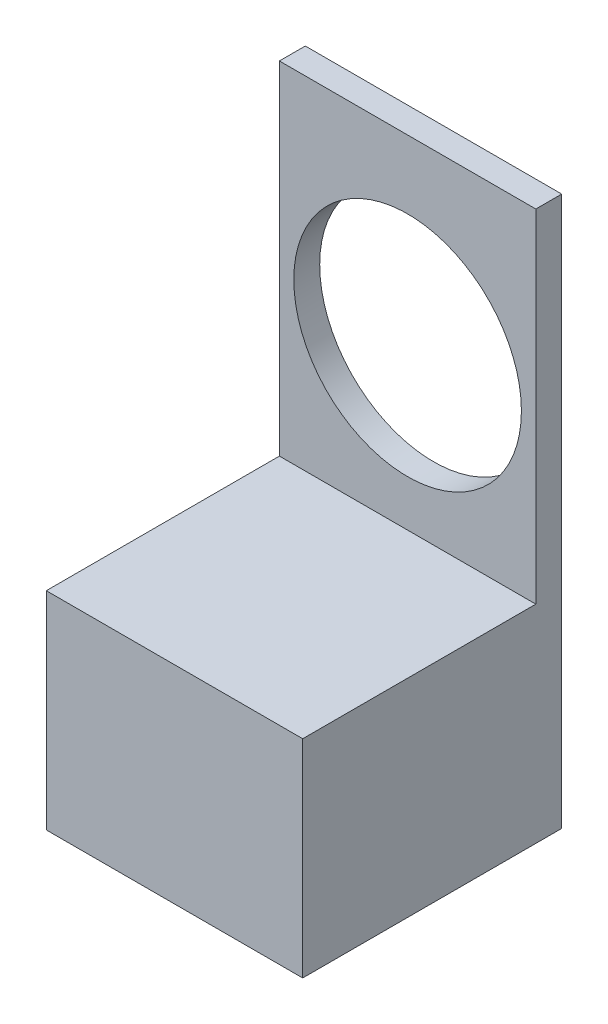
ISO-10303-21;
HEADER;
FILE_DESCRIPTION(('STEP AP214'),'2;1');
FILE_NAME('part.step','',(''),(''),'','','');
FILE_SCHEMA(('AUTOMOTIVE_DESIGN { 1 0 10303 214 1 1 1 1 }'));
ENDSEC;
DATA;
#1=APPLICATION_CONTEXT('core data for automotive mechanical design processes');
#2=APPLICATION_PROTOCOL_DEFINITION('international standard','automotive_design',2000,#1);
#3=PRODUCT_CONTEXT('',#1,'mechanical');
#4=PRODUCT('Part','Part','',(#3));
#5=PRODUCT_RELATED_PRODUCT_CATEGORY('part','',(#4));
#6=PRODUCT_DEFINITION_FORMATION('','',#4);
#7=PRODUCT_DEFINITION_CONTEXT('part definition',#1,'design');
#8=PRODUCT_DEFINITION('design','',#6,#7);
#9=PRODUCT_DEFINITION_SHAPE('','',#8);
#10=(LENGTH_UNIT() NAMED_UNIT(*) SI_UNIT(.MILLI.,.METRE.));
#11=(NAMED_UNIT(*) PLANE_ANGLE_UNIT() SI_UNIT($,.RADIAN.));
#12=(NAMED_UNIT(*) SI_UNIT($,.STERADIAN.) SOLID_ANGLE_UNIT());
#13=UNCERTAINTY_MEASURE_WITH_UNIT(LENGTH_MEASURE(1.E-05),#10,'distance_accuracy_value','');
#14=(GEOMETRIC_REPRESENTATION_CONTEXT(3) GLOBAL_UNCERTAINTY_ASSIGNED_CONTEXT((#13)) GLOBAL_UNIT_ASSIGNED_CONTEXT((#10,
#11,#12)) REPRESENTATION_CONTEXT('',''));
#15=CARTESIAN_POINT('',(0.,0.,0.));
#16=DIRECTION('',(0.,0.,1.));
#17=DIRECTION('',(1.,0.,0.));
#18=AXIS2_PLACEMENT_3D('',#15,#16,#17);
#19=CARTESIAN_POINT('',(0.,20.32,0.));
#20=DIRECTION('',(1.,0.,0.));
#21=DIRECTION('',(0.,0.,-1.));
#22=AXIS2_PLACEMENT_3D('',#19,#20,#21);
#23=PLANE('',#22);
#24=DIRECTION('',(0.,0.,1.));
#25=VECTOR('',#24,1.);
#26=CARTESIAN_POINT('',(0.,0.,0.));
#27=LINE('',#26,#25);
#28=CARTESIAN_POINT('',(0.,0.,-25.4));
#29=VERTEX_POINT('',#28);
#30=CARTESIAN_POINT('',(0.,0.,0.));
#31=VERTEX_POINT('',#30);
#32=EDGE_CURVE('E95',#29,#31,#27,.T.);
#33=ORIENTED_EDGE('',*,*,#32,.T.);
#34=DIRECTION('',(0.,-1.,0.));
#35=VECTOR('',#34,1.);
#36=CARTESIAN_POINT('',(0.,20.32,0.));
#37=LINE('',#36,#35);
#38=CARTESIAN_POINT('',(0.,20.32,0.));
#39=VERTEX_POINT('',#38);
#40=EDGE_CURVE('E11',#39,#31,#37,.T.);
#41=ORIENTED_EDGE('',*,*,#40,.F.);
#42=DIRECTION('',(0.,0.,1.));
#43=VECTOR('',#42,1.);
#44=CARTESIAN_POINT('',(0.,20.32,0.));
#45=LINE('',#44,#43);
#46=CARTESIAN_POINT('',(0.,20.32,-22.86));
#47=VERTEX_POINT('',#46);
#48=EDGE_CURVE('E87',#47,#39,#45,.T.);
#49=ORIENTED_EDGE('',*,*,#48,.F.);
#50=DIRECTION('',(0.,1.,0.));
#51=VECTOR('',#50,1.);
#52=CARTESIAN_POINT('',(0.,0.,-22.86));
#53=LINE('',#52,#51);
#54=CARTESIAN_POINT('',(0.,53.8773045383891,-22.86));
#55=VERTEX_POINT('',#54);
#56=EDGE_CURVE('E49',#47,#55,#53,.T.);
#57=ORIENTED_EDGE('',*,*,#56,.T.);
#58=DIRECTION('',(0.,0.,1.));
#59=VECTOR('',#58,1.);
#60=CARTESIAN_POINT('',(0.,53.8773045383891,-25.4));
#61=LINE('',#60,#59);
#62=CARTESIAN_POINT('',(0.,53.8773045383891,-25.4));
#63=VERTEX_POINT('',#62);
#64=EDGE_CURVE('E102',#63,#55,#61,.T.);
#65=ORIENTED_EDGE('',*,*,#64,.F.);
#66=DIRECTION('',(0.,1.,0.));
#67=VECTOR('',#66,1.);
#68=CARTESIAN_POINT('',(0.,0.,-25.4));
#69=LINE('',#68,#67);
#70=EDGE_CURVE('E99',#29,#63,#69,.T.);
#71=ORIENTED_EDGE('',*,*,#70,.F.);
#72=EDGE_LOOP('',(#33,#41,#49,#57,#65,#71));
#73=FACE_BOUND('',#72,.T.);
#74=ADVANCED_FACE('F33',(#73),#23,.F.);
#75=CARTESIAN_POINT('',(0.,20.32,0.));
#76=DIRECTION('',(0.,0.,-1.));
#77=DIRECTION('',(-1.,0.,0.));
#78=AXIS2_PLACEMENT_3D('',#75,#76,#77);
#79=PLANE('',#78);
#80=DIRECTION('',(1.,0.,0.));
#81=VECTOR('',#80,1.);
#82=CARTESIAN_POINT('',(0.,0.,0.));
#83=LINE('',#82,#81);
#84=CARTESIAN_POINT('',(25.146,0.,0.));
#85=VERTEX_POINT('',#84);
#86=EDGE_CURVE('E62',#31,#85,#83,.T.);
#87=ORIENTED_EDGE('',*,*,#86,.T.);
#88=DIRECTION('',(0.,-1.,0.));
#89=VECTOR('',#88,1.);
#90=CARTESIAN_POINT('',(25.146,20.32,0.));
#91=LINE('',#90,#89);
#92=CARTESIAN_POINT('',(25.146,20.32,0.));
#93=VERTEX_POINT('',#92);
#94=EDGE_CURVE('E41',#93,#85,#91,.T.);
#95=ORIENTED_EDGE('',*,*,#94,.F.);
#96=DIRECTION('',(1.,0.,0.));
#97=VECTOR('',#96,1.);
#98=CARTESIAN_POINT('',(0.,20.32,0.));
#99=LINE('',#98,#97);
#100=EDGE_CURVE('E77',#39,#93,#99,.T.);
#101=ORIENTED_EDGE('',*,*,#100,.F.);
#102=ORIENTED_EDGE('',*,*,#40,.T.);
#103=EDGE_LOOP('',(#87,#95,#101,#102));
#104=FACE_BOUND('',#103,.T.);
#105=ADVANCED_FACE('F79',(#104),#79,.F.);
#106=CARTESIAN_POINT('',(25.146,20.32,0.));
#107=DIRECTION('',(-1.,0.,0.));
#108=DIRECTION('',(0.,0.,1.));
#109=AXIS2_PLACEMENT_3D('',#106,#107,#108);
#110=PLANE('',#109);
#111=DIRECTION('',(0.,0.,-1.));
#112=VECTOR('',#111,1.);
#113=CARTESIAN_POINT('',(25.146,0.,0.));
#114=LINE('',#113,#112);
#115=CARTESIAN_POINT('',(25.146,0.,-25.4));
#116=VERTEX_POINT('',#115);
#117=EDGE_CURVE('E92',#85,#116,#114,.T.);
#118=ORIENTED_EDGE('',*,*,#117,.T.);
#119=DIRECTION('',(0.,-1.,0.));
#120=VECTOR('',#119,1.);
#121=CARTESIAN_POINT('',(25.146,53.8773045383891,-25.4));
#122=LINE('',#121,#120);
#123=CARTESIAN_POINT('',(25.146,53.8773045383891,-25.4));
#124=VERTEX_POINT('',#123);
#125=EDGE_CURVE('E120',#124,#116,#122,.T.);
#126=ORIENTED_EDGE('',*,*,#125,.F.);
#127=DIRECTION('',(0.,0.,1.));
#128=VECTOR('',#127,1.);
#129=CARTESIAN_POINT('',(25.146,53.8773045383891,-25.4));
#130=LINE('',#129,#128);
#131=CARTESIAN_POINT('',(25.146,53.8773045383891,-22.86));
#132=VERTEX_POINT('',#131);
#133=EDGE_CURVE('E106',#124,#132,#130,.T.);
#134=ORIENTED_EDGE('',*,*,#133,.T.);
#135=DIRECTION('',(0.,-1.,0.));
#136=VECTOR('',#135,1.);
#137=CARTESIAN_POINT('',(25.146,53.8773045383891,-22.86));
#138=LINE('',#137,#136);
#139=CARTESIAN_POINT('',(25.146,20.32,-22.86));
#140=VERTEX_POINT('',#139);
#141=EDGE_CURVE('E122',#132,#140,#138,.T.);
#142=ORIENTED_EDGE('',*,*,#141,.T.);
#143=DIRECTION('',(0.,0.,-1.));
#144=VECTOR('',#143,1.);
#145=CARTESIAN_POINT('',(25.146,20.32,0.));
#146=LINE('',#145,#144);
#147=EDGE_CURVE('E86',#93,#140,#146,.T.);
#148=ORIENTED_EDGE('',*,*,#147,.F.);
#149=ORIENTED_EDGE('',*,*,#94,.T.);
#150=EDGE_LOOP('',(#118,#126,#134,#142,#148,#149));
#151=FACE_BOUND('',#150,.T.);
#152=ADVANCED_FACE('F155',(#151),#110,.F.);
#153=CARTESIAN_POINT('',(0.,20.32,0.));
#154=DIRECTION('',(0.,-1.,0.));
#155=DIRECTION('',(0.,0.,-1.));
#156=AXIS2_PLACEMENT_3D('',#153,#154,#155);
#157=PLANE('',#156);
#158=ORIENTED_EDGE('',*,*,#48,.T.);
#159=ORIENTED_EDGE('',*,*,#100,.T.);
#160=ORIENTED_EDGE('',*,*,#147,.T.);
#161=DIRECTION('',(-1.,0.,0.));
#162=VECTOR('',#161,1.);
#163=CARTESIAN_POINT('',(0.,20.32,-22.86));
#164=LINE('',#163,#162);
#165=EDGE_CURVE('E66',#140,#47,#164,.T.);
#166=ORIENTED_EDGE('',*,*,#165,.T.);
#167=EDGE_LOOP('',(#158,#159,#160,#166));
#168=FACE_BOUND('',#167,.T.);
#169=ADVANCED_FACE('F90',(#168),#157,.F.);
#170=CARTESIAN_POINT('',(0.,0.,0.));
#171=DIRECTION('',(0.,-1.,0.));
#172=DIRECTION('',(0.,0.,-1.));
#173=AXIS2_PLACEMENT_3D('',#170,#171,#172);
#174=PLANE('',#173);
#175=ORIENTED_EDGE('',*,*,#32,.F.);
#176=DIRECTION('',(-1.,0.,0.));
#177=VECTOR('',#176,1.);
#178=CARTESIAN_POINT('',(25.146,0.,-25.4));
#179=LINE('',#178,#177);
#180=EDGE_CURVE('E127',#116,#29,#179,.T.);
#181=ORIENTED_EDGE('',*,*,#180,.F.);
#182=ORIENTED_EDGE('',*,*,#117,.F.);
#183=ORIENTED_EDGE('',*,*,#86,.F.);
#184=EDGE_LOOP('',(#175,#181,#182,#183));
#185=FACE_BOUND('',#184,.T.);
#186=ADVANCED_FACE('F156',(#185),#174,.T.);
#187=CARTESIAN_POINT('',(0.,53.8773045383891,-25.4));
#188=DIRECTION('',(0.,-1.,0.));
#189=DIRECTION('',(0.,0.,-1.));
#190=AXIS2_PLACEMENT_3D('',#187,#188,#189);
#191=PLANE('',#190);
#192=DIRECTION('',(1.,0.,0.));
#193=VECTOR('',#192,1.);
#194=CARTESIAN_POINT('',(0.,53.8773045383891,-22.86));
#195=LINE('',#194,#193);
#196=EDGE_CURVE('E117',#55,#132,#195,.T.);
#197=ORIENTED_EDGE('',*,*,#196,.T.);
#198=ORIENTED_EDGE('',*,*,#133,.F.);
#199=DIRECTION('',(1.,0.,0.));
#200=VECTOR('',#199,1.);
#201=CARTESIAN_POINT('',(0.,53.8773045383891,-25.4));
#202=LINE('',#201,#200);
#203=EDGE_CURVE('E116',#63,#124,#202,.T.);
#204=ORIENTED_EDGE('',*,*,#203,.F.);
#205=ORIENTED_EDGE('',*,*,#64,.T.);
#206=EDGE_LOOP('',(#197,#198,#204,#205));
#207=FACE_BOUND('',#206,.T.);
#208=ADVANCED_FACE('F148',(#207),#191,.F.);
#209=CARTESIAN_POINT('',(0.,0.,-25.4));
#210=DIRECTION('',(0.,0.,-1.));
#211=DIRECTION('',(-1.,0.,0.));
#212=AXIS2_PLACEMENT_3D('',#209,#210,#211);
#213=PLANE('',#212);
#214=CARTESIAN_POINT('',(12.573,36.0170665264548,-25.4));
#215=DIRECTION('',(0.,0.,-1.));
#216=DIRECTION('',(-1.,0.,0.));
#217=AXIS2_PLACEMENT_3D('',#214,#215,#216);
#218=CIRCLE('',#217,11.1597834786109);
#219=CARTESIAN_POINT('',(1.4132165213891,36.0170665264548,-25.4));
#220=VERTEX_POINT('',#219);
#221=EDGE_CURVE('E131',#220,#220,#218,.T.);
#222=ORIENTED_EDGE('',*,*,#221,.F.);
#223=EDGE_LOOP('',(#222));
#224=FACE_BOUND('',#223,.T.);
#225=ORIENTED_EDGE('',*,*,#125,.T.);
#226=ORIENTED_EDGE('',*,*,#180,.T.);
#227=ORIENTED_EDGE('',*,*,#70,.T.);
#228=ORIENTED_EDGE('',*,*,#203,.T.);
#229=EDGE_LOOP('',(#225,#226,#227,#228));
#230=FACE_BOUND('',#229,.T.);
#231=ADVANCED_FACE('F145',(#224,#230),#213,.T.);
#232=CARTESIAN_POINT('',(0.,0.,-22.86));
#233=DIRECTION('',(0.,0.,-1.));
#234=DIRECTION('',(-1.,0.,0.));
#235=AXIS2_PLACEMENT_3D('',#232,#233,#234);
#236=PLANE('',#235);
#237=CARTESIAN_POINT('',(12.573,36.0170665264548,-22.86));
#238=DIRECTION('',(0.,0.,-1.));
#239=DIRECTION('',(-1.,0.,0.));
#240=AXIS2_PLACEMENT_3D('',#237,#238,#239);
#241=CIRCLE('',#240,11.1597834786109);
#242=CARTESIAN_POINT('',(1.4132165213891,36.0170665264548,-22.86));
#243=VERTEX_POINT('',#242);
#244=EDGE_CURVE('E124',#243,#243,#241,.T.);
#245=ORIENTED_EDGE('',*,*,#244,.T.);
#246=EDGE_LOOP('',(#245));
#247=FACE_BOUND('',#246,.T.);
#248=ORIENTED_EDGE('',*,*,#165,.F.);
#249=ORIENTED_EDGE('',*,*,#141,.F.);
#250=ORIENTED_EDGE('',*,*,#196,.F.);
#251=ORIENTED_EDGE('',*,*,#56,.F.);
#252=EDGE_LOOP('',(#248,#249,#250,#251));
#253=FACE_BOUND('',#252,.T.);
#254=ADVANCED_FACE('F137',(#247,#253),#236,.F.);
#255=CARTESIAN_POINT('',(12.573,36.0170665264548,-22.86));
#256=DIRECTION('',(0.,0.,-1.));
#257=DIRECTION('',(-1.,0.,0.));
#258=AXIS2_PLACEMENT_3D('',#255,#256,#257);
#259=CYLINDRICAL_SURFACE('',#258,11.1597834786109);
#260=ORIENTED_EDGE('',*,*,#244,.F.);
#261=EDGE_LOOP('',(#260));
#262=FACE_BOUND('',#261,.T.);
#263=ORIENTED_EDGE('',*,*,#221,.T.);
#264=EDGE_LOOP('',(#263));
#265=FACE_BOUND('',#264,.T.);
#266=ADVANCED_FACE('F139',(#262,#265),#259,.F.);
#267=CLOSED_SHELL('',(#74,#105,#152,#169,#186,#208,#231,#254,#266));
#268=MANIFOLD_SOLID_BREP('B2',#267);
#269=ADVANCED_BREP_SHAPE_REPRESENTATION('',(#18,#268),#14);
#270=SHAPE_DEFINITION_REPRESENTATION(#9,#269);
ENDSEC;
END-ISO-10303-21;
